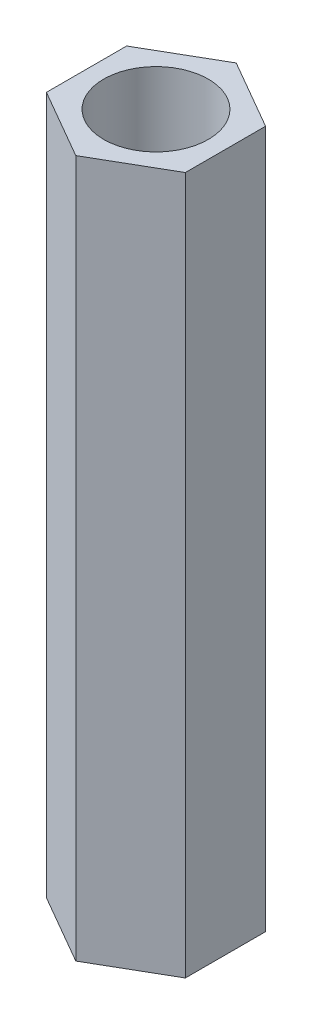
ISO-10303-21;
HEADER;
FILE_DESCRIPTION(('STEP AP214'),'2;1');
FILE_NAME('part.step','',(''),(''),'','','');
FILE_SCHEMA(('AUTOMOTIVE_DESIGN { 1 0 10303 214 1 1 1 1 }'));
ENDSEC;
DATA;
#1=APPLICATION_CONTEXT('core data for automotive mechanical design processes');
#2=APPLICATION_PROTOCOL_DEFINITION('international standard','automotive_design',2000,#1);
#3=PRODUCT_CONTEXT('',#1,'mechanical');
#4=PRODUCT('Part','Part','',(#3));
#5=PRODUCT_RELATED_PRODUCT_CATEGORY('part','',(#4));
#6=PRODUCT_DEFINITION_FORMATION('','',#4);
#7=PRODUCT_DEFINITION_CONTEXT('part definition',#1,'design');
#8=PRODUCT_DEFINITION('design','',#6,#7);
#9=PRODUCT_DEFINITION_SHAPE('','',#8);
#10=(LENGTH_UNIT() NAMED_UNIT(*) SI_UNIT(.MILLI.,.METRE.));
#11=(NAMED_UNIT(*) PLANE_ANGLE_UNIT() SI_UNIT($,.RADIAN.));
#12=(NAMED_UNIT(*) SI_UNIT($,.STERADIAN.) SOLID_ANGLE_UNIT());
#13=UNCERTAINTY_MEASURE_WITH_UNIT(LENGTH_MEASURE(1.E-05),#10,'distance_accuracy_value','');
#14=(GEOMETRIC_REPRESENTATION_CONTEXT(3) GLOBAL_UNCERTAINTY_ASSIGNED_CONTEXT((#13)) GLOBAL_UNIT_ASSIGNED_CONTEXT((#10,
#11,#12)) REPRESENTATION_CONTEXT('',''));
#15=CARTESIAN_POINT('',(0.,0.,0.));
#16=DIRECTION('',(0.,0.,1.));
#17=DIRECTION('',(1.,0.,0.));
#18=AXIS2_PLACEMENT_3D('',#15,#16,#17);
#19=CARTESIAN_POINT('',(0.,20.,0.));
#20=DIRECTION('',(0.,1.,0.));
#21=DIRECTION('',(0.,0.,1.));
#22=AXIS2_PLACEMENT_3D('',#19,#20,#21);
#23=PLANE('',#22);
#24=DIRECTION('',(-0.866025403784439,0.,-0.5));
#25=VECTOR('',#24,1.);
#26=CARTESIAN_POINT('',(1.99185842870421,20.,-1.15));
#27=LINE('',#26,#25);
#28=CARTESIAN_POINT('',(1.99185842870421,20.,-1.15));
#29=VERTEX_POINT('',#28);
#30=CARTESIAN_POINT('',(0.,20.,-2.3));
#31=VERTEX_POINT('',#30);
#32=EDGE_CURVE('E137',#29,#31,#27,.T.);
#33=ORIENTED_EDGE('',*,*,#32,.T.);
#34=DIRECTION('',(-0.866025403784439,0.,0.5));
#35=VECTOR('',#34,1.);
#36=CARTESIAN_POINT('',(0.,20.,-2.3));
#37=LINE('',#36,#35);
#38=CARTESIAN_POINT('',(-1.99185842870421,20.,-1.15));
#39=VERTEX_POINT('',#38);
#40=EDGE_CURVE('E95',#31,#39,#37,.T.);
#41=ORIENTED_EDGE('',*,*,#40,.T.);
#42=DIRECTION('',(0.,0.,1.));
#43=VECTOR('',#42,1.);
#44=CARTESIAN_POINT('',(-1.99185842870421,20.,-1.15));
#45=LINE('',#44,#43);
#46=CARTESIAN_POINT('',(-1.99185842870421,20.,1.15));
#47=VERTEX_POINT('',#46);
#48=EDGE_CURVE('E108',#39,#47,#45,.T.);
#49=ORIENTED_EDGE('',*,*,#48,.T.);
#50=DIRECTION('',(0.866025403784439,0.,0.5));
#51=VECTOR('',#50,1.);
#52=CARTESIAN_POINT('',(-1.99185842870421,20.,1.15));
#53=LINE('',#52,#51);
#54=CARTESIAN_POINT('',(0.,20.,2.3));
#55=VERTEX_POINT('',#54);
#56=EDGE_CURVE('E102',#47,#55,#53,.T.);
#57=ORIENTED_EDGE('',*,*,#56,.T.);
#58=DIRECTION('',(0.866025403784439,0.,-0.5));
#59=VECTOR('',#58,1.);
#60=CARTESIAN_POINT('',(0.,20.,2.3));
#61=LINE('',#60,#59);
#62=CARTESIAN_POINT('',(1.99185842870421,20.,1.15));
#63=VERTEX_POINT('',#62);
#64=EDGE_CURVE('E106',#55,#63,#61,.T.);
#65=ORIENTED_EDGE('',*,*,#64,.T.);
#66=DIRECTION('',(0.,0.,-1.));
#67=VECTOR('',#66,1.);
#68=CARTESIAN_POINT('',(1.99185842870421,20.,1.15));
#69=LINE('',#68,#67);
#70=EDGE_CURVE('E58',#63,#29,#69,.T.);
#71=ORIENTED_EDGE('',*,*,#70,.T.);
#72=EDGE_LOOP('',(#33,#41,#49,#57,#65,#71));
#73=FACE_BOUND('',#72,.T.);
#74=CARTESIAN_POINT('',(0.,20.,0.));
#75=DIRECTION('',(0.,1.,0.));
#76=DIRECTION('',(0.,0.,1.));
#77=AXIS2_PLACEMENT_3D('',#74,#75,#76);
#78=CIRCLE('',#77,1.5);
#79=CARTESIAN_POINT('',(0.,20.,1.5));
#80=VERTEX_POINT('',#79);
#81=EDGE_CURVE('E130',#80,#80,#78,.T.);
#82=ORIENTED_EDGE('',*,*,#81,.F.);
#83=EDGE_LOOP('',(#82));
#84=FACE_BOUND('',#83,.T.);
#85=ADVANCED_FACE('F41',(#73,#84),#23,.T.);
#86=CARTESIAN_POINT('',(0.,0.,0.));
#87=DIRECTION('',(0.,1.,0.));
#88=DIRECTION('',(0.,0.,1.));
#89=AXIS2_PLACEMENT_3D('',#86,#87,#88);
#90=PLANE('',#89);
#91=DIRECTION('',(-0.866025403784439,0.,-0.5));
#92=VECTOR('',#91,1.);
#93=CARTESIAN_POINT('',(1.99185842870421,0.,-1.15));
#94=LINE('',#93,#92);
#95=CARTESIAN_POINT('',(1.99185842870421,0.,-1.15));
#96=VERTEX_POINT('',#95);
#97=CARTESIAN_POINT('',(0.,0.,-2.3));
#98=VERTEX_POINT('',#97);
#99=EDGE_CURVE('E126',#96,#98,#94,.T.);
#100=ORIENTED_EDGE('',*,*,#99,.F.);
#101=DIRECTION('',(0.,0.,-1.));
#102=VECTOR('',#101,1.);
#103=CARTESIAN_POINT('',(1.99185842870421,0.,1.15));
#104=LINE('',#103,#102);
#105=CARTESIAN_POINT('',(1.99185842870421,0.,1.15));
#106=VERTEX_POINT('',#105);
#107=EDGE_CURVE('E87',#106,#96,#104,.T.);
#108=ORIENTED_EDGE('',*,*,#107,.F.);
#109=DIRECTION('',(0.866025403784439,0.,-0.5));
#110=VECTOR('',#109,1.);
#111=CARTESIAN_POINT('',(0.,0.,2.3));
#112=LINE('',#111,#110);
#113=CARTESIAN_POINT('',(0.,0.,2.3));
#114=VERTEX_POINT('',#113);
#115=EDGE_CURVE('E81',#114,#106,#112,.T.);
#116=ORIENTED_EDGE('',*,*,#115,.F.);
#117=DIRECTION('',(0.866025403784439,0.,0.5));
#118=VECTOR('',#117,1.);
#119=CARTESIAN_POINT('',(-1.99185842870421,0.,1.15));
#120=LINE('',#119,#118);
#121=CARTESIAN_POINT('',(-1.99185842870421,0.,1.15));
#122=VERTEX_POINT('',#121);
#123=EDGE_CURVE('E116',#122,#114,#120,.T.);
#124=ORIENTED_EDGE('',*,*,#123,.F.);
#125=DIRECTION('',(0.,0.,1.));
#126=VECTOR('',#125,1.);
#127=CARTESIAN_POINT('',(-1.99185842870421,0.,-1.15));
#128=LINE('',#127,#126);
#129=CARTESIAN_POINT('',(-1.99185842870421,0.,-1.15));
#130=VERTEX_POINT('',#129);
#131=EDGE_CURVE('E132',#130,#122,#128,.T.);
#132=ORIENTED_EDGE('',*,*,#131,.F.);
#133=DIRECTION('',(-0.866025403784439,0.,0.5));
#134=VECTOR('',#133,1.);
#135=CARTESIAN_POINT('',(0.,0.,-2.3));
#136=LINE('',#135,#134);
#137=EDGE_CURVE('E129',#98,#130,#136,.T.);
#138=ORIENTED_EDGE('',*,*,#137,.F.);
#139=EDGE_LOOP('',(#100,#108,#116,#124,#132,#138));
#140=FACE_BOUND('',#139,.T.);
#141=CARTESIAN_POINT('',(0.,0.,0.));
#142=DIRECTION('',(0.,1.,0.));
#143=DIRECTION('',(0.,0.,1.));
#144=AXIS2_PLACEMENT_3D('',#141,#142,#143);
#145=CIRCLE('',#144,1.5);
#146=CARTESIAN_POINT('',(0.,0.,1.5));
#147=VERTEX_POINT('',#146);
#148=EDGE_CURVE('E230',#147,#147,#145,.T.);
#149=ORIENTED_EDGE('',*,*,#148,.T.);
#150=EDGE_LOOP('',(#149));
#151=FACE_BOUND('',#150,.T.);
#152=ADVANCED_FACE('F146',(#140,#151),#90,.F.);
#153=CARTESIAN_POINT('',(1.99185842870421,20.,-1.15));
#154=DIRECTION('',(-0.5,0.,0.866025403784439));
#155=DIRECTION('',(0.866025403784439,0.,0.5));
#156=AXIS2_PLACEMENT_3D('',#153,#154,#155);
#157=PLANE('',#156);
#158=ORIENTED_EDGE('',*,*,#99,.T.);
#159=DIRECTION('',(0.,-1.,0.));
#160=VECTOR('',#159,1.);
#161=CARTESIAN_POINT('',(0.,20.,-2.3));
#162=LINE('',#161,#160);
#163=EDGE_CURVE('E11',#31,#98,#162,.T.);
#164=ORIENTED_EDGE('',*,*,#163,.F.);
#165=ORIENTED_EDGE('',*,*,#32,.F.);
#166=DIRECTION('',(0.,-1.,0.));
#167=VECTOR('',#166,1.);
#168=CARTESIAN_POINT('',(1.99185842870421,20.,-1.15));
#169=LINE('',#168,#167);
#170=EDGE_CURVE('E122',#29,#96,#169,.T.);
#171=ORIENTED_EDGE('',*,*,#170,.T.);
#172=EDGE_LOOP('',(#158,#164,#165,#171));
#173=FACE_BOUND('',#172,.T.);
#174=ADVANCED_FACE('F43',(#173),#157,.F.);
#175=CARTESIAN_POINT('',(0.,20.,-2.3));
#176=DIRECTION('',(0.5,0.,0.866025403784439));
#177=DIRECTION('',(0.866025403784439,0.,-0.5));
#178=AXIS2_PLACEMENT_3D('',#175,#176,#177);
#179=PLANE('',#178);
#180=ORIENTED_EDGE('',*,*,#137,.T.);
#181=DIRECTION('',(0.,-1.,0.));
#182=VECTOR('',#181,1.);
#183=CARTESIAN_POINT('',(-1.99185842870421,20.,-1.15));
#184=LINE('',#183,#182);
#185=EDGE_CURVE('E50',#39,#130,#184,.T.);
#186=ORIENTED_EDGE('',*,*,#185,.F.);
#187=ORIENTED_EDGE('',*,*,#40,.F.);
#188=ORIENTED_EDGE('',*,*,#163,.T.);
#189=EDGE_LOOP('',(#180,#186,#187,#188));
#190=FACE_BOUND('',#189,.T.);
#191=ADVANCED_FACE('F171',(#190),#179,.F.);
#192=CARTESIAN_POINT('',(-1.99185842870421,20.,-1.15));
#193=DIRECTION('',(1.,0.,0.));
#194=DIRECTION('',(0.,0.,-1.));
#195=AXIS2_PLACEMENT_3D('',#192,#193,#194);
#196=PLANE('',#195);
#197=ORIENTED_EDGE('',*,*,#131,.T.);
#198=DIRECTION('',(0.,-1.,0.));
#199=VECTOR('',#198,1.);
#200=CARTESIAN_POINT('',(-1.99185842870421,20.,1.15));
#201=LINE('',#200,#199);
#202=EDGE_CURVE('E117',#47,#122,#201,.T.);
#203=ORIENTED_EDGE('',*,*,#202,.F.);
#204=ORIENTED_EDGE('',*,*,#48,.F.);
#205=ORIENTED_EDGE('',*,*,#185,.T.);
#206=EDGE_LOOP('',(#197,#203,#204,#205));
#207=FACE_BOUND('',#206,.T.);
#208=ADVANCED_FACE('F143',(#207),#196,.F.);
#209=CARTESIAN_POINT('',(-1.99185842870421,20.,1.15));
#210=DIRECTION('',(0.5,0.,-0.866025403784439));
#211=DIRECTION('',(-0.866025403784439,0.,-0.5));
#212=AXIS2_PLACEMENT_3D('',#209,#210,#211);
#213=PLANE('',#212);
#214=ORIENTED_EDGE('',*,*,#123,.T.);
#215=DIRECTION('',(0.,-1.,0.));
#216=VECTOR('',#215,1.);
#217=CARTESIAN_POINT('',(0.,20.,2.3));
#218=LINE('',#217,#216);
#219=EDGE_CURVE('E113',#55,#114,#218,.T.);
#220=ORIENTED_EDGE('',*,*,#219,.F.);
#221=ORIENTED_EDGE('',*,*,#56,.F.);
#222=ORIENTED_EDGE('',*,*,#202,.T.);
#223=EDGE_LOOP('',(#214,#220,#221,#222));
#224=FACE_BOUND('',#223,.T.);
#225=ADVANCED_FACE('F114',(#224),#213,.F.);
#226=CARTESIAN_POINT('',(0.,20.,2.3));
#227=DIRECTION('',(-0.5,0.,-0.866025403784439));
#228=DIRECTION('',(-0.866025403784439,0.,0.5));
#229=AXIS2_PLACEMENT_3D('',#226,#227,#228);
#230=PLANE('',#229);
#231=ORIENTED_EDGE('',*,*,#115,.T.);
#232=DIRECTION('',(0.,-1.,0.));
#233=VECTOR('',#232,1.);
#234=CARTESIAN_POINT('',(1.99185842870421,20.,1.15));
#235=LINE('',#234,#233);
#236=EDGE_CURVE('E118',#63,#106,#235,.T.);
#237=ORIENTED_EDGE('',*,*,#236,.F.);
#238=ORIENTED_EDGE('',*,*,#64,.F.);
#239=ORIENTED_EDGE('',*,*,#219,.T.);
#240=EDGE_LOOP('',(#231,#237,#238,#239));
#241=FACE_BOUND('',#240,.T.);
#242=ADVANCED_FACE('F120',(#241),#230,.F.);
#243=CARTESIAN_POINT('',(1.99185842870421,20.,1.15));
#244=DIRECTION('',(-1.,0.,0.));
#245=DIRECTION('',(0.,0.,1.));
#246=AXIS2_PLACEMENT_3D('',#243,#244,#245);
#247=PLANE('',#246);
#248=ORIENTED_EDGE('',*,*,#107,.T.);
#249=ORIENTED_EDGE('',*,*,#170,.F.);
#250=ORIENTED_EDGE('',*,*,#70,.F.);
#251=ORIENTED_EDGE('',*,*,#236,.T.);
#252=EDGE_LOOP('',(#248,#249,#250,#251));
#253=FACE_BOUND('',#252,.T.);
#254=ADVANCED_FACE('F151',(#253),#247,.F.);
#255=CARTESIAN_POINT('',(0.,20.,0.));
#256=DIRECTION('',(0.,-1.,0.));
#257=DIRECTION('',(0.,0.,-1.));
#258=AXIS2_PLACEMENT_3D('',#255,#256,#257);
#259=CYLINDRICAL_SURFACE('',#258,1.5);
#260=ORIENTED_EDGE('',*,*,#81,.T.);
#261=EDGE_LOOP('',(#260));
#262=FACE_BOUND('',#261,.T.);
#263=ORIENTED_EDGE('',*,*,#148,.F.);
#264=EDGE_LOOP('',(#263));
#265=FACE_BOUND('',#264,.T.);
#266=ADVANCED_FACE('F153',(#262,#265),#259,.F.);
#267=CLOSED_SHELL('',(#85,#152,#174,#191,#208,#225,#242,#254,#266));
#268=MANIFOLD_SOLID_BREP('B2',#267);
#269=ADVANCED_BREP_SHAPE_REPRESENTATION('',(#18,#268),#14);
#270=SHAPE_DEFINITION_REPRESENTATION(#9,#269);
ENDSEC;
END-ISO-10303-21;
